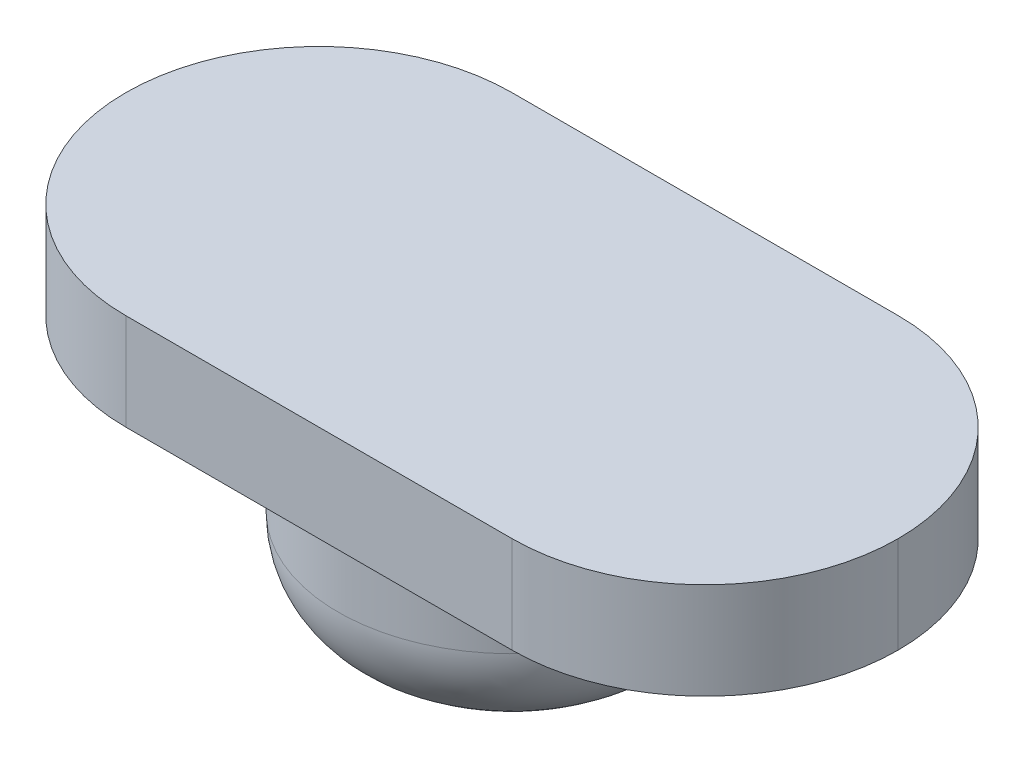
ISO-10303-21;
HEADER;
FILE_DESCRIPTION(('STEP AP214'),'2;1');
FILE_NAME('part.step','',(''),(''),'','','');
FILE_SCHEMA(('AUTOMOTIVE_DESIGN { 1 0 10303 214 1 1 1 1 }'));
ENDSEC;
DATA;
#1=APPLICATION_CONTEXT('core data for automotive mechanical design processes');
#2=APPLICATION_PROTOCOL_DEFINITION('international standard','automotive_design',2000,#1);
#3=PRODUCT_CONTEXT('',#1,'mechanical');
#4=PRODUCT('Part','Part','',(#3));
#5=PRODUCT_RELATED_PRODUCT_CATEGORY('part','',(#4));
#6=PRODUCT_DEFINITION_FORMATION('','',#4);
#7=PRODUCT_DEFINITION_CONTEXT('part definition',#1,'design');
#8=PRODUCT_DEFINITION('design','',#6,#7);
#9=PRODUCT_DEFINITION_SHAPE('','',#8);
#10=(LENGTH_UNIT() NAMED_UNIT(*) SI_UNIT(.MILLI.,.METRE.));
#11=(NAMED_UNIT(*) PLANE_ANGLE_UNIT() SI_UNIT($,.RADIAN.));
#12=(NAMED_UNIT(*) SI_UNIT($,.STERADIAN.) SOLID_ANGLE_UNIT());
#13=UNCERTAINTY_MEASURE_WITH_UNIT(LENGTH_MEASURE(1.E-05),#10,'distance_accuracy_value','');
#14=(GEOMETRIC_REPRESENTATION_CONTEXT(3) GLOBAL_UNCERTAINTY_ASSIGNED_CONTEXT((#13)) GLOBAL_UNIT_ASSIGNED_CONTEXT((#10,
#11,#12)) REPRESENTATION_CONTEXT('',''));
#15=CARTESIAN_POINT('',(0.,0.,0.));
#16=DIRECTION('',(0.,0.,1.));
#17=DIRECTION('',(1.,0.,0.));
#18=AXIS2_PLACEMENT_3D('',#15,#16,#17);
#19=CARTESIAN_POINT('',(-10.,-2.5,-45.));
#20=DIRECTION('',(0.,0.,1.));
#21=DIRECTION('',(1.,0.,0.));
#22=AXIS2_PLACEMENT_3D('',#19,#20,#21);
#23=PLANE('',#22);
#24=DIRECTION('',(1.,0.,0.));
#25=VECTOR('',#24,1.);
#26=CARTESIAN_POINT('',(-10.,-2.5,-45.));
#27=LINE('',#26,#25);
#28=CARTESIAN_POINT('',(-5.,-2.5,-45.));
#29=VERTEX_POINT('',#28);
#30=CARTESIAN_POINT('',(5.,-2.5,-45.));
#31=VERTEX_POINT('',#30);
#32=EDGE_CURVE('E165',#29,#31,#27,.T.);
#33=ORIENTED_EDGE('',*,*,#32,.F.);
#34=DIRECTION('',(0.,1.,0.));
#35=VECTOR('',#34,1.);
#36=CARTESIAN_POINT('',(-5.,-2.5,-45.));
#37=LINE('',#36,#35);
#38=CARTESIAN_POINT('',(-5.,0.,-45.));
#39=VERTEX_POINT('',#38);
#40=EDGE_CURVE('E144',#29,#39,#37,.T.);
#41=ORIENTED_EDGE('',*,*,#40,.T.);
#42=DIRECTION('',(1.,0.,0.));
#43=VECTOR('',#42,1.);
#44=CARTESIAN_POINT('',(-10.,0.,-45.));
#45=LINE('',#44,#43);
#46=CARTESIAN_POINT('',(5.,0.,-45.));
#47=VERTEX_POINT('',#46);
#48=EDGE_CURVE('E103',#39,#47,#45,.T.);
#49=ORIENTED_EDGE('',*,*,#48,.T.);
#50=DIRECTION('',(0.,1.,0.));
#51=VECTOR('',#50,1.);
#52=CARTESIAN_POINT('',(5.,-2.5,-45.));
#53=LINE('',#52,#51);
#54=EDGE_CURVE('E142',#47,#31,#53,.F.);
#55=ORIENTED_EDGE('',*,*,#54,.T.);
#56=EDGE_LOOP('',(#33,#41,#49,#55));
#57=FACE_BOUND('',#56,.T.);
#58=ADVANCED_FACE('F41',(#57),#23,.F.);
#59=CARTESIAN_POINT('',(-10.,-2.5,-35.));
#60=DIRECTION('',(0.,0.,-1.));
#61=DIRECTION('',(-1.,0.,0.));
#62=AXIS2_PLACEMENT_3D('',#59,#60,#61);
#63=PLANE('',#62);
#64=DIRECTION('',(-1.,0.,0.));
#65=VECTOR('',#64,1.);
#66=CARTESIAN_POINT('',(-10.,0.,-35.));
#67=LINE('',#66,#65);
#68=CARTESIAN_POINT('',(5.,0.,-35.));
#69=VERTEX_POINT('',#68);
#70=CARTESIAN_POINT('',(-5.,0.,-35.));
#71=VERTEX_POINT('',#70);
#72=EDGE_CURVE('E167',#69,#71,#67,.T.);
#73=ORIENTED_EDGE('',*,*,#72,.T.);
#74=DIRECTION('',(0.,1.,0.));
#75=VECTOR('',#74,1.);
#76=CARTESIAN_POINT('',(-5.,-2.5,-35.));
#77=LINE('',#76,#75);
#78=CARTESIAN_POINT('',(-5.,-2.5,-35.));
#79=VERTEX_POINT('',#78);
#80=EDGE_CURVE('E122',#71,#79,#77,.F.);
#81=ORIENTED_EDGE('',*,*,#80,.T.);
#82=DIRECTION('',(-1.,0.,0.));
#83=VECTOR('',#82,1.);
#84=CARTESIAN_POINT('',(-10.,-2.5,-35.));
#85=LINE('',#84,#83);
#86=CARTESIAN_POINT('',(5.,-2.5,-35.));
#87=VERTEX_POINT('',#86);
#88=EDGE_CURVE('E164',#87,#79,#85,.T.);
#89=ORIENTED_EDGE('',*,*,#88,.F.);
#90=DIRECTION('',(0.,1.,0.));
#91=VECTOR('',#90,1.);
#92=CARTESIAN_POINT('',(5.,-2.5,-35.));
#93=LINE('',#92,#91);
#94=EDGE_CURVE('E125',#87,#69,#93,.T.);
#95=ORIENTED_EDGE('',*,*,#94,.T.);
#96=EDGE_LOOP('',(#73,#81,#89,#95));
#97=FACE_BOUND('',#96,.T.);
#98=ADVANCED_FACE('F200',(#97),#63,.F.);
#99=CARTESIAN_POINT('',(0.,-2.5,0.));
#100=DIRECTION('',(0.,-1.,0.));
#101=DIRECTION('',(0.,0.,-1.));
#102=AXIS2_PLACEMENT_3D('',#99,#100,#101);
#103=PLANE('',#102);
#104=CARTESIAN_POINT('',(0.,-2.5,-40.));
#105=DIRECTION('',(0.,-1.,0.));
#106=DIRECTION('',(0.,0.,-1.));
#107=AXIS2_PLACEMENT_3D('',#104,#105,#106);
#108=CIRCLE('',#107,4.5);
#109=CARTESIAN_POINT('',(0.,-2.5,-44.5));
#110=VERTEX_POINT('',#109);
#111=EDGE_CURVE('E150',#110,#110,#108,.T.);
#112=ORIENTED_EDGE('',*,*,#111,.F.);
#113=EDGE_LOOP('',(#112));
#114=FACE_BOUND('',#113,.T.);
#115=ORIENTED_EDGE('',*,*,#88,.T.);
#116=CARTESIAN_POINT('',(-5.,-2.5,-40.));
#117=DIRECTION('',(0.,-1.,0.));
#118=DIRECTION('',(0.,0.,-1.));
#119=AXIS2_PLACEMENT_3D('',#116,#117,#118);
#120=CIRCLE('',#119,5.);
#121=CARTESIAN_POINT('',(-10.,-2.5,-40.));
#122=VERTEX_POINT('',#121);
#123=EDGE_CURVE('E136',#79,#122,#120,.T.);
#124=ORIENTED_EDGE('',*,*,#123,.T.);
#125=CARTESIAN_POINT('',(-5.,-2.5,-40.));
#126=DIRECTION('',(0.,-1.,0.));
#127=DIRECTION('',(0.,0.,-1.));
#128=AXIS2_PLACEMENT_3D('',#125,#126,#127);
#129=CIRCLE('',#128,5.);
#130=EDGE_CURVE('E114',#122,#29,#129,.T.);
#131=ORIENTED_EDGE('',*,*,#130,.T.);
#132=ORIENTED_EDGE('',*,*,#32,.T.);
#133=CARTESIAN_POINT('',(5.,-2.5,-40.));
#134=DIRECTION('',(0.,-1.,0.));
#135=DIRECTION('',(0.,0.,-1.));
#136=AXIS2_PLACEMENT_3D('',#133,#134,#135);
#137=CIRCLE('',#136,5.);
#138=CARTESIAN_POINT('',(10.,-2.5,-40.));
#139=VERTEX_POINT('',#138);
#140=EDGE_CURVE('E60',#31,#139,#137,.T.);
#141=ORIENTED_EDGE('',*,*,#140,.T.);
#142=CARTESIAN_POINT('',(5.,-2.5,-40.));
#143=DIRECTION('',(0.,-1.,0.));
#144=DIRECTION('',(0.,0.,-1.));
#145=AXIS2_PLACEMENT_3D('',#142,#143,#144);
#146=CIRCLE('',#145,5.);
#147=EDGE_CURVE('E132',#139,#87,#146,.T.);
#148=ORIENTED_EDGE('',*,*,#147,.T.);
#149=EDGE_LOOP('',(#115,#124,#131,#132,#141,#148));
#150=FACE_BOUND('',#149,.T.);
#151=ADVANCED_FACE('F204',(#114,#150),#103,.T.);
#152=CARTESIAN_POINT('',(0.,0.,0.));
#153=DIRECTION('',(0.,-1.,0.));
#154=DIRECTION('',(0.,0.,-1.));
#155=AXIS2_PLACEMENT_3D('',#152,#153,#154);
#156=PLANE('',#155);
#157=CARTESIAN_POINT('',(-5.,0.,-40.));
#158=DIRECTION('',(0.,-1.,0.));
#159=DIRECTION('',(0.,0.,-1.));
#160=AXIS2_PLACEMENT_3D('',#157,#158,#159);
#161=CIRCLE('',#160,5.);
#162=CARTESIAN_POINT('',(-10.,0.,-40.));
#163=VERTEX_POINT('',#162);
#164=EDGE_CURVE('E92',#39,#163,#161,.F.);
#165=ORIENTED_EDGE('',*,*,#164,.T.);
#166=CARTESIAN_POINT('',(-5.,0.,-40.));
#167=DIRECTION('',(0.,-1.,0.));
#168=DIRECTION('',(0.,0.,-1.));
#169=AXIS2_PLACEMENT_3D('',#166,#167,#168);
#170=CIRCLE('',#169,5.);
#171=EDGE_CURVE('E99',#163,#71,#170,.F.);
#172=ORIENTED_EDGE('',*,*,#171,.T.);
#173=ORIENTED_EDGE('',*,*,#72,.F.);
#174=CARTESIAN_POINT('',(5.,0.,-40.));
#175=DIRECTION('',(0.,-1.,0.));
#176=DIRECTION('',(0.,0.,-1.));
#177=AXIS2_PLACEMENT_3D('',#174,#175,#176);
#178=CIRCLE('',#177,5.);
#179=CARTESIAN_POINT('',(10.,0.,-40.));
#180=VERTEX_POINT('',#179);
#181=EDGE_CURVE('E168',#69,#180,#178,.F.);
#182=ORIENTED_EDGE('',*,*,#181,.T.);
#183=CARTESIAN_POINT('',(5.,0.,-40.));
#184=DIRECTION('',(0.,-1.,0.));
#185=DIRECTION('',(0.,0.,-1.));
#186=AXIS2_PLACEMENT_3D('',#183,#184,#185);
#187=CIRCLE('',#186,5.);
#188=EDGE_CURVE('E110',#180,#47,#187,.F.);
#189=ORIENTED_EDGE('',*,*,#188,.T.);
#190=ORIENTED_EDGE('',*,*,#48,.F.);
#191=EDGE_LOOP('',(#165,#172,#173,#182,#189,#190));
#192=FACE_BOUND('',#191,.T.);
#193=ADVANCED_FACE('F100',(#192),#156,.F.);
#194=CARTESIAN_POINT('',(-5.,-2.5,-40.));
#195=DIRECTION('',(0.,1.,0.));
#196=DIRECTION('',(0.,0.,1.));
#197=AXIS2_PLACEMENT_3D('',#194,#195,#196);
#198=CYLINDRICAL_SURFACE('',#197,5.);
#199=ORIENTED_EDGE('',*,*,#40,.F.);
#200=ORIENTED_EDGE('',*,*,#130,.F.);
#201=DIRECTION('',(0.,1.,0.));
#202=VECTOR('',#201,1.);
#203=CARTESIAN_POINT('',(-10.,-2.5,-40.));
#204=LINE('',#203,#202);
#205=EDGE_CURVE('E112',#163,#122,#204,.F.);
#206=ORIENTED_EDGE('',*,*,#205,.F.);
#207=ORIENTED_EDGE('',*,*,#164,.F.);
#208=EDGE_LOOP('',(#199,#200,#206,#207));
#209=FACE_BOUND('',#208,.T.);
#210=ADVANCED_FACE('F115',(#209),#198,.T.);
#211=CARTESIAN_POINT('',(-5.,-2.5,-40.));
#212=DIRECTION('',(0.,1.,0.));
#213=DIRECTION('',(0.,0.,1.));
#214=AXIS2_PLACEMENT_3D('',#211,#212,#213);
#215=CYLINDRICAL_SURFACE('',#214,5.);
#216=ORIENTED_EDGE('',*,*,#123,.F.);
#217=ORIENTED_EDGE('',*,*,#80,.F.);
#218=ORIENTED_EDGE('',*,*,#171,.F.);
#219=ORIENTED_EDGE('',*,*,#205,.T.);
#220=EDGE_LOOP('',(#216,#217,#218,#219));
#221=FACE_BOUND('',#220,.T.);
#222=ADVANCED_FACE('F118',(#221),#215,.T.);
#223=CARTESIAN_POINT('',(5.,-2.5,-40.));
#224=DIRECTION('',(0.,1.,0.));
#225=DIRECTION('',(0.,0.,1.));
#226=AXIS2_PLACEMENT_3D('',#223,#224,#225);
#227=CYLINDRICAL_SURFACE('',#226,5.);
#228=ORIENTED_EDGE('',*,*,#94,.F.);
#229=ORIENTED_EDGE('',*,*,#147,.F.);
#230=DIRECTION('',(0.,1.,0.));
#231=VECTOR('',#230,1.);
#232=CARTESIAN_POINT('',(10.,-2.5,-40.));
#233=LINE('',#232,#231);
#234=EDGE_CURVE('E116',#180,#139,#233,.F.);
#235=ORIENTED_EDGE('',*,*,#234,.F.);
#236=ORIENTED_EDGE('',*,*,#181,.F.);
#237=EDGE_LOOP('',(#228,#229,#235,#236));
#238=FACE_BOUND('',#237,.T.);
#239=ADVANCED_FACE('F186',(#238),#227,.T.);
#240=CARTESIAN_POINT('',(5.,-2.5,-40.));
#241=DIRECTION('',(0.,1.,0.));
#242=DIRECTION('',(0.,0.,1.));
#243=AXIS2_PLACEMENT_3D('',#240,#241,#242);
#244=CYLINDRICAL_SURFACE('',#243,5.);
#245=ORIENTED_EDGE('',*,*,#140,.F.);
#246=ORIENTED_EDGE('',*,*,#54,.F.);
#247=ORIENTED_EDGE('',*,*,#188,.F.);
#248=ORIENTED_EDGE('',*,*,#234,.T.);
#249=EDGE_LOOP('',(#245,#246,#247,#248));
#250=FACE_BOUND('',#249,.T.);
#251=ADVANCED_FACE('F181',(#250),#244,.T.);
#252=CARTESIAN_POINT('',(0.,-6.9,-40.));
#253=DIRECTION('',(0.,1.,0.));
#254=DIRECTION('',(0.,0.,1.));
#255=AXIS2_PLACEMENT_3D('',#252,#253,#254);
#256=CYLINDRICAL_SURFACE('',#255,4.5);
#257=CARTESIAN_POINT('',(0.,-4.4,-40.));
#258=DIRECTION('',(0.,-1.,0.));
#259=DIRECTION('',(0.,0.,-1.));
#260=AXIS2_PLACEMENT_3D('',#257,#258,#259);
#261=CIRCLE('',#260,4.5);
#262=CARTESIAN_POINT('',(0.,-4.4,-44.5));
#263=VERTEX_POINT('',#262);
#264=EDGE_CURVE('E11',#263,#263,#261,.F.);
#265=ORIENTED_EDGE('',*,*,#264,.T.);
#266=EDGE_LOOP('',(#265));
#267=FACE_BOUND('',#266,.T.);
#268=ORIENTED_EDGE('',*,*,#111,.T.);
#269=EDGE_LOOP('',(#268));
#270=FACE_BOUND('',#269,.T.);
#271=ADVANCED_FACE('F183',(#267,#270),#256,.T.);
#272=CARTESIAN_POINT('',(0.,-6.9,-40.));
#273=DIRECTION('',(0.,-1.,0.));
#274=DIRECTION('',(0.,0.,-1.));
#275=AXIS2_PLACEMENT_3D('',#272,#273,#274);
#276=PLANE('',#275);
#277=CARTESIAN_POINT('',(0.,-6.9,-40.));
#278=DIRECTION('',(0.,-1.,0.));
#279=DIRECTION('',(0.,0.,-1.));
#280=AXIS2_PLACEMENT_3D('',#277,#278,#279);
#281=CIRCLE('',#280,2.);
#282=CARTESIAN_POINT('',(0.,-6.9,-42.));
#283=VERTEX_POINT('',#282);
#284=EDGE_CURVE('E49',#283,#283,#281,.T.);
#285=ORIENTED_EDGE('',*,*,#284,.T.);
#286=EDGE_LOOP('',(#285));
#287=FACE_BOUND('',#286,.T.);
#288=ADVANCED_FACE('F195',(#287),#276,.T.);
#289=CARTESIAN_POINT('',(0.,-4.4,-40.));
#290=DIRECTION('',(0.,-1.,0.));
#291=DIRECTION('',(0.,0.,-1.));
#292=AXIS2_PLACEMENT_3D('',#289,#290,#291);
#293=DEGENERATE_TOROIDAL_SURFACE('',#292,2.,2.5,.T.);
#294=ORIENTED_EDGE('',*,*,#264,.F.);
#295=EDGE_LOOP('',(#294));
#296=FACE_BOUND('',#295,.T.);
#297=ORIENTED_EDGE('',*,*,#284,.F.);
#298=EDGE_LOOP('',(#297));
#299=FACE_BOUND('',#298,.T.);
#300=ADVANCED_FACE('F43',(#296,#299),#293,.T.);
#301=CLOSED_SHELL('',(#58,#98,#151,#193,#210,#222,#239,#251,#271,#288,#300));
#302=MANIFOLD_SOLID_BREP('B2',#301);
#303=ADVANCED_BREP_SHAPE_REPRESENTATION('',(#18,#302),#14);
#304=SHAPE_DEFINITION_REPRESENTATION(#9,#303);
ENDSEC;
END-ISO-10303-21;
